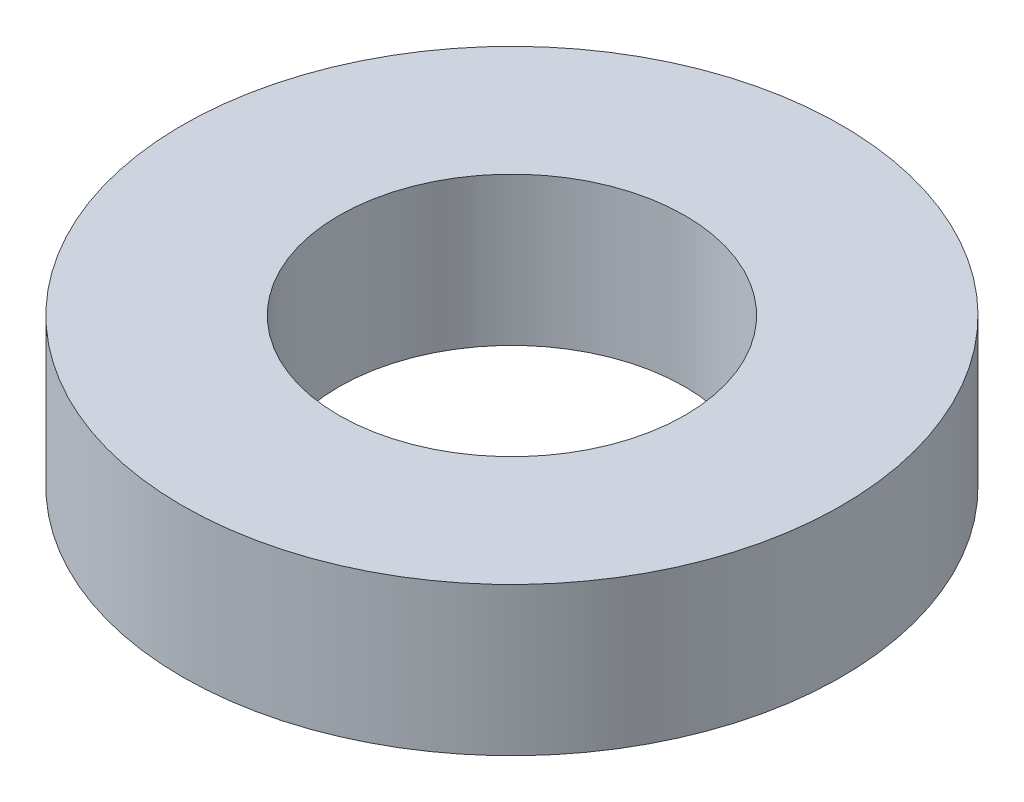
ISO-10303-21;
HEADER;
FILE_DESCRIPTION(('STEP AP214'),'2;1');
FILE_NAME('part.step','',(''),(''),'','','');
FILE_SCHEMA(('AUTOMOTIVE_DESIGN { 1 0 10303 214 1 1 1 1 }'));
ENDSEC;
DATA;
#1=APPLICATION_CONTEXT('core data for automotive mechanical design processes');
#2=APPLICATION_PROTOCOL_DEFINITION('international standard','automotive_design',2000,#1);
#3=PRODUCT_CONTEXT('',#1,'mechanical');
#4=PRODUCT('Part','Part','',(#3));
#5=PRODUCT_RELATED_PRODUCT_CATEGORY('part','',(#4));
#6=PRODUCT_DEFINITION_FORMATION('','',#4);
#7=PRODUCT_DEFINITION_CONTEXT('part definition',#1,'design');
#8=PRODUCT_DEFINITION('design','',#6,#7);
#9=PRODUCT_DEFINITION_SHAPE('','',#8);
#10=(LENGTH_UNIT() NAMED_UNIT(*) SI_UNIT(.MILLI.,.METRE.));
#11=(NAMED_UNIT(*) PLANE_ANGLE_UNIT() SI_UNIT($,.RADIAN.));
#12=(NAMED_UNIT(*) SI_UNIT($,.STERADIAN.) SOLID_ANGLE_UNIT());
#13=UNCERTAINTY_MEASURE_WITH_UNIT(LENGTH_MEASURE(1.E-05),#10,'distance_accuracy_value','');
#14=(GEOMETRIC_REPRESENTATION_CONTEXT(3) GLOBAL_UNCERTAINTY_ASSIGNED_CONTEXT((#13)) GLOBAL_UNIT_ASSIGNED_CONTEXT((#10,
#11,#12)) REPRESENTATION_CONTEXT('',''));
#15=CARTESIAN_POINT('',(0.,0.,0.));
#16=DIRECTION('',(0.,0.,1.));
#17=DIRECTION('',(1.,0.,0.));
#18=AXIS2_PLACEMENT_3D('',#15,#16,#17);
#19=CARTESIAN_POINT('',(0.,1.8,0.));
#20=DIRECTION('',(0.,1.,0.));
#21=DIRECTION('',(0.,0.,1.));
#22=AXIS2_PLACEMENT_3D('',#19,#20,#21);
#23=PLANE('',#22);
#24=CARTESIAN_POINT('',(0.,1.8,0.));
#25=DIRECTION('',(0.,1.,0.));
#26=DIRECTION('',(0.,0.,1.));
#27=AXIS2_PLACEMENT_3D('',#24,#25,#26);
#28=CIRCLE('',#27,4.);
#29=CARTESIAN_POINT('',(0.,1.8,4.));
#30=VERTEX_POINT('',#29);
#31=EDGE_CURVE('E10',#30,#30,#28,.T.);
#32=ORIENTED_EDGE('',*,*,#31,.T.);
#33=EDGE_LOOP('',(#32));
#34=FACE_BOUND('',#33,.T.);
#35=CARTESIAN_POINT('',(0.,1.8,0.));
#36=DIRECTION('',(0.,1.,0.));
#37=DIRECTION('',(0.,0.,1.));
#38=AXIS2_PLACEMENT_3D('',#35,#36,#37);
#39=CIRCLE('',#38,2.1);
#40=CARTESIAN_POINT('',(0.,1.8,2.1));
#41=VERTEX_POINT('',#40);
#42=EDGE_CURVE('E44',#41,#41,#39,.T.);
#43=ORIENTED_EDGE('',*,*,#42,.F.);
#44=EDGE_LOOP('',(#43));
#45=FACE_BOUND('',#44,.T.);
#46=ADVANCED_FACE('F33',(#34,#45),#23,.T.);
#47=CARTESIAN_POINT('',(0.,0.,0.));
#48=DIRECTION('',(0.,1.,0.));
#49=DIRECTION('',(0.,0.,1.));
#50=AXIS2_PLACEMENT_3D('',#47,#48,#49);
#51=PLANE('',#50);
#52=CARTESIAN_POINT('',(0.,0.,0.));
#53=DIRECTION('',(0.,1.,0.));
#54=DIRECTION('',(0.,0.,1.));
#55=AXIS2_PLACEMENT_3D('',#52,#53,#54);
#56=CIRCLE('',#55,4.);
#57=CARTESIAN_POINT('',(0.,0.,4.));
#58=VERTEX_POINT('',#57);
#59=EDGE_CURVE('E37',#58,#58,#56,.T.);
#60=ORIENTED_EDGE('',*,*,#59,.F.);
#61=EDGE_LOOP('',(#60));
#62=FACE_BOUND('',#61,.T.);
#63=CARTESIAN_POINT('',(0.,0.,0.));
#64=DIRECTION('',(0.,1.,0.));
#65=DIRECTION('',(0.,0.,1.));
#66=AXIS2_PLACEMENT_3D('',#63,#64,#65);
#67=CIRCLE('',#66,2.1);
#68=CARTESIAN_POINT('',(0.,0.,2.1));
#69=VERTEX_POINT('',#68);
#70=EDGE_CURVE('E46',#69,#69,#67,.T.);
#71=ORIENTED_EDGE('',*,*,#70,.T.);
#72=EDGE_LOOP('',(#71));
#73=FACE_BOUND('',#72,.T.);
#74=ADVANCED_FACE('F56',(#62,#73),#51,.F.);
#75=CARTESIAN_POINT('',(0.,1.8,0.));
#76=DIRECTION('',(0.,-1.,0.));
#77=DIRECTION('',(0.,0.,-1.));
#78=AXIS2_PLACEMENT_3D('',#75,#76,#77);
#79=CYLINDRICAL_SURFACE('',#78,4.);
#80=ORIENTED_EDGE('',*,*,#31,.F.);
#81=EDGE_LOOP('',(#80));
#82=FACE_BOUND('',#81,.T.);
#83=ORIENTED_EDGE('',*,*,#59,.T.);
#84=EDGE_LOOP('',(#83));
#85=FACE_BOUND('',#84,.T.);
#86=ADVANCED_FACE('F35',(#82,#85),#79,.T.);
#87=CARTESIAN_POINT('',(0.,1.8,0.));
#88=DIRECTION('',(0.,-1.,0.));
#89=DIRECTION('',(0.,0.,-1.));
#90=AXIS2_PLACEMENT_3D('',#87,#88,#89);
#91=CYLINDRICAL_SURFACE('',#90,2.1);
#92=ORIENTED_EDGE('',*,*,#42,.T.);
#93=EDGE_LOOP('',(#92));
#94=FACE_BOUND('',#93,.T.);
#95=ORIENTED_EDGE('',*,*,#70,.F.);
#96=EDGE_LOOP('',(#95));
#97=FACE_BOUND('',#96,.T.);
#98=ADVANCED_FACE('F52',(#94,#97),#91,.F.);
#99=CLOSED_SHELL('',(#46,#74,#86,#98));
#100=MANIFOLD_SOLID_BREP('B2',#99);
#101=ADVANCED_BREP_SHAPE_REPRESENTATION('',(#18,#100),#14);
#102=SHAPE_DEFINITION_REPRESENTATION(#9,#101);
ENDSEC;
END-ISO-10303-21;
